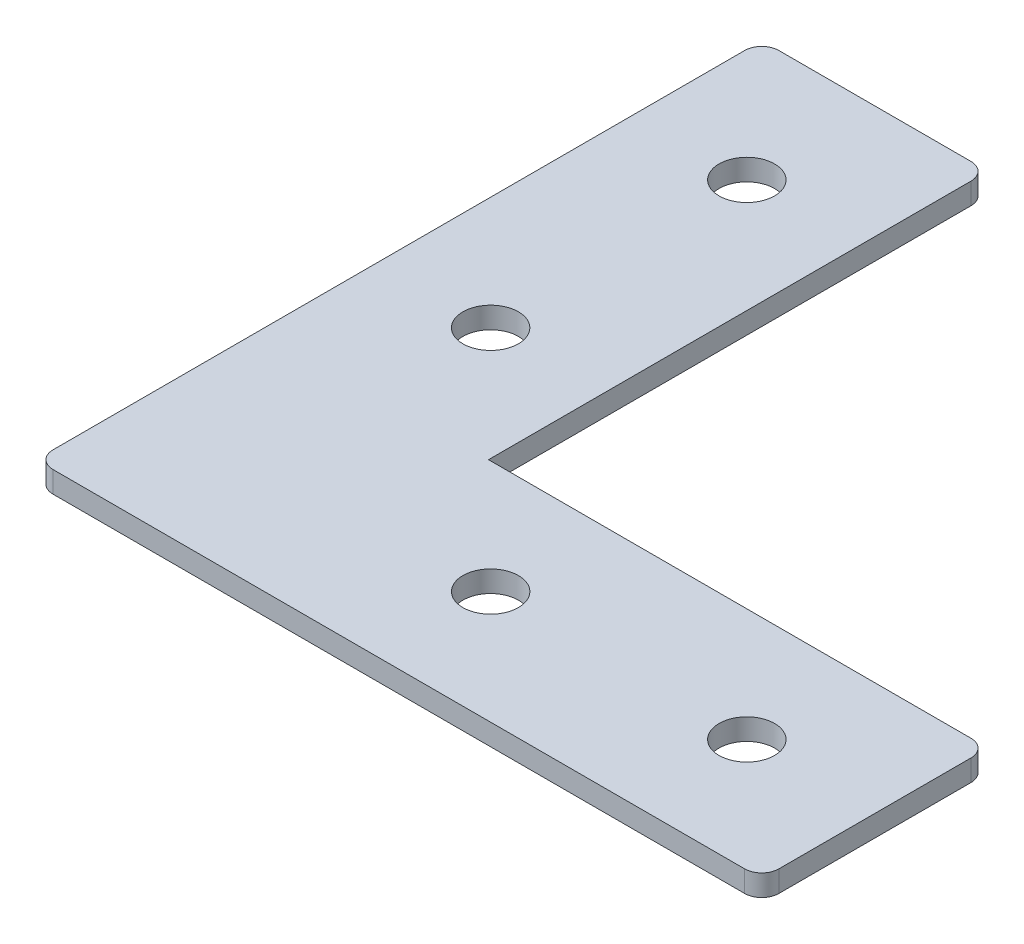
ISO-10303-21;
HEADER;
FILE_DESCRIPTION(('STEP AP214'),'2;1');
FILE_NAME('part.step','',(''),(''),'','','');
FILE_SCHEMA(('AUTOMOTIVE_DESIGN { 1 0 10303 214 1 1 1 1 }'));
ENDSEC;
DATA;
#1=APPLICATION_CONTEXT('core data for automotive mechanical design processes');
#2=APPLICATION_PROTOCOL_DEFINITION('international standard','automotive_design',2000,#1);
#3=PRODUCT_CONTEXT('',#1,'mechanical');
#4=PRODUCT('Part','Part','',(#3));
#5=PRODUCT_RELATED_PRODUCT_CATEGORY('part','',(#4));
#6=PRODUCT_DEFINITION_FORMATION('','',#4);
#7=PRODUCT_DEFINITION_CONTEXT('part definition',#1,'design');
#8=PRODUCT_DEFINITION('design','',#6,#7);
#9=PRODUCT_DEFINITION_SHAPE('','',#8);
#10=(LENGTH_UNIT() NAMED_UNIT(*) SI_UNIT(.MILLI.,.METRE.));
#11=(NAMED_UNIT(*) PLANE_ANGLE_UNIT() SI_UNIT($,.RADIAN.));
#12=(NAMED_UNIT(*) SI_UNIT($,.STERADIAN.) SOLID_ANGLE_UNIT());
#13=UNCERTAINTY_MEASURE_WITH_UNIT(LENGTH_MEASURE(1.E-05),#10,'distance_accuracy_value','');
#14=(GEOMETRIC_REPRESENTATION_CONTEXT(3) GLOBAL_UNCERTAINTY_ASSIGNED_CONTEXT((#13)) GLOBAL_UNIT_ASSIGNED_CONTEXT((#10,
#11,#12)) REPRESENTATION_CONTEXT('',''));
#15=CARTESIAN_POINT('',(0.,0.,0.));
#16=DIRECTION('',(0.,0.,1.));
#17=DIRECTION('',(1.,0.,0.));
#18=AXIS2_PLACEMENT_3D('',#15,#16,#17);
#19=CARTESIAN_POINT('',(0.,2.5,0.));
#20=DIRECTION('',(0.,0.,-1.));
#21=DIRECTION('',(-1.,0.,0.));
#22=AXIS2_PLACEMENT_3D('',#19,#20,#21);
#23=PLANE('',#22);
#24=DIRECTION('',(1.,0.,0.));
#25=VECTOR('',#24,1.);
#26=CARTESIAN_POINT('',(0.,0.,0.));
#27=LINE('',#26,#25);
#28=CARTESIAN_POINT('',(2.,0.,0.));
#29=VERTEX_POINT('',#28);
#30=CARTESIAN_POINT('',(83.,0.,0.));
#31=VERTEX_POINT('',#30);
#32=EDGE_CURVE('E159',#29,#31,#27,.T.);
#33=ORIENTED_EDGE('',*,*,#32,.T.);
#34=DIRECTION('',(0.,-1.,0.));
#35=VECTOR('',#34,1.);
#36=CARTESIAN_POINT('',(83.,2.5,0.));
#37=LINE('',#36,#35);
#38=CARTESIAN_POINT('',(83.,2.5,0.));
#39=VERTEX_POINT('',#38);
#40=EDGE_CURVE('E192',#31,#39,#37,.F.);
#41=ORIENTED_EDGE('',*,*,#40,.T.);
#42=DIRECTION('',(1.,0.,0.));
#43=VECTOR('',#42,1.);
#44=CARTESIAN_POINT('',(0.,2.5,0.));
#45=LINE('',#44,#43);
#46=CARTESIAN_POINT('',(2.,2.5,0.));
#47=VERTEX_POINT('',#46);
#48=EDGE_CURVE('E152',#47,#39,#45,.T.);
#49=ORIENTED_EDGE('',*,*,#48,.F.);
#50=DIRECTION('',(0.,-1.,0.));
#51=VECTOR('',#50,1.);
#52=CARTESIAN_POINT('',(2.,0.,0.));
#53=LINE('',#52,#51);
#54=EDGE_CURVE('E189',#47,#29,#53,.T.);
#55=ORIENTED_EDGE('',*,*,#54,.T.);
#56=EDGE_LOOP('',(#33,#41,#49,#55));
#57=FACE_BOUND('',#56,.T.);
#58=ADVANCED_FACE('F39',(#57),#23,.F.);
#59=CARTESIAN_POINT('',(85.,2.5,0.));
#60=DIRECTION('',(-1.,0.,0.));
#61=DIRECTION('',(0.,0.,1.));
#62=AXIS2_PLACEMENT_3D('',#59,#60,#61);
#63=PLANE('',#62);
#64=DIRECTION('',(0.,0.,-1.));
#65=VECTOR('',#64,1.);
#66=CARTESIAN_POINT('',(85.,2.5,0.));
#67=LINE('',#66,#65);
#68=CARTESIAN_POINT('',(85.,2.5,-2.));
#69=VERTEX_POINT('',#68);
#70=CARTESIAN_POINT('',(85.,2.5,-24.5));
#71=VERTEX_POINT('',#70);
#72=EDGE_CURVE('E150',#69,#71,#67,.T.);
#73=ORIENTED_EDGE('',*,*,#72,.F.);
#74=DIRECTION('',(0.,-1.,0.));
#75=VECTOR('',#74,1.);
#76=CARTESIAN_POINT('',(85.,2.5,-2.));
#77=LINE('',#76,#75);
#78=CARTESIAN_POINT('',(85.,0.,-2.));
#79=VERTEX_POINT('',#78);
#80=EDGE_CURVE('E176',#69,#79,#77,.T.);
#81=ORIENTED_EDGE('',*,*,#80,.T.);
#82=DIRECTION('',(0.,0.,-1.));
#83=VECTOR('',#82,1.);
#84=CARTESIAN_POINT('',(85.,0.,0.));
#85=LINE('',#84,#83);
#86=CARTESIAN_POINT('',(85.,0.,-24.5));
#87=VERTEX_POINT('',#86);
#88=EDGE_CURVE('E162',#79,#87,#85,.T.);
#89=ORIENTED_EDGE('',*,*,#88,.T.);
#90=DIRECTION('',(0.,-1.,0.));
#91=VECTOR('',#90,1.);
#92=CARTESIAN_POINT('',(85.,2.5,-24.5));
#93=LINE('',#92,#91);
#94=EDGE_CURVE('E135',#87,#71,#93,.F.);
#95=ORIENTED_EDGE('',*,*,#94,.T.);
#96=EDGE_LOOP('',(#73,#81,#89,#95));
#97=FACE_BOUND('',#96,.T.);
#98=ADVANCED_FACE('F290',(#97),#63,.F.);
#99=CARTESIAN_POINT('',(26.5,2.5,-26.5));
#100=DIRECTION('',(0.,0.,-1.));
#101=DIRECTION('',(-1.,0.,0.));
#102=AXIS2_PLACEMENT_3D('',#99,#100,#101);
#103=PLANE('',#102);
#104=DIRECTION('',(1.,0.,0.));
#105=VECTOR('',#104,1.);
#106=CARTESIAN_POINT('',(26.5,2.5,-26.5));
#107=LINE('',#106,#105);
#108=CARTESIAN_POINT('',(26.5,2.5,-26.5));
#109=VERTEX_POINT('',#108);
#110=CARTESIAN_POINT('',(83.,2.5,-26.5));
#111=VERTEX_POINT('',#110);
#112=EDGE_CURVE('E128',#109,#111,#107,.T.);
#113=ORIENTED_EDGE('',*,*,#112,.T.);
#114=DIRECTION('',(0.,-1.,0.));
#115=VECTOR('',#114,1.);
#116=CARTESIAN_POINT('',(83.,0.,-26.5));
#117=LINE('',#116,#115);
#118=CARTESIAN_POINT('',(83.,0.,-26.5));
#119=VERTEX_POINT('',#118);
#120=EDGE_CURVE('E202',#111,#119,#117,.T.);
#121=ORIENTED_EDGE('',*,*,#120,.T.);
#122=DIRECTION('',(1.,0.,0.));
#123=VECTOR('',#122,1.);
#124=CARTESIAN_POINT('',(26.5,0.,-26.5));
#125=LINE('',#124,#123);
#126=CARTESIAN_POINT('',(26.5,0.,-26.5));
#127=VERTEX_POINT('',#126);
#128=EDGE_CURVE('E131',#127,#119,#125,.T.);
#129=ORIENTED_EDGE('',*,*,#128,.F.);
#130=DIRECTION('',(0.,-1.,0.));
#131=VECTOR('',#130,1.);
#132=CARTESIAN_POINT('',(26.5,2.5,-26.5));
#133=LINE('',#132,#131);
#134=EDGE_CURVE('E123',#109,#127,#133,.T.);
#135=ORIENTED_EDGE('',*,*,#134,.F.);
#136=EDGE_LOOP('',(#113,#121,#129,#135));
#137=FACE_BOUND('',#136,.T.);
#138=ADVANCED_FACE('F125',(#137),#103,.T.);
#139=CARTESIAN_POINT('',(26.5,2.5,-26.5));
#140=DIRECTION('',(-1.,0.,0.));
#141=DIRECTION('',(0.,0.,1.));
#142=AXIS2_PLACEMENT_3D('',#139,#140,#141);
#143=PLANE('',#142);
#144=DIRECTION('',(0.,0.,-1.));
#145=VECTOR('',#144,1.);
#146=CARTESIAN_POINT('',(26.5,0.,-26.5));
#147=LINE('',#146,#145);
#148=CARTESIAN_POINT('',(26.5,0.,-83.));
#149=VERTEX_POINT('',#148);
#150=EDGE_CURVE('E167',#127,#149,#147,.T.);
#151=ORIENTED_EDGE('',*,*,#150,.T.);
#152=DIRECTION('',(0.,-1.,0.));
#153=VECTOR('',#152,1.);
#154=CARTESIAN_POINT('',(26.5,2.5,-83.));
#155=LINE('',#154,#153);
#156=CARTESIAN_POINT('',(26.5,2.5,-83.));
#157=VERTEX_POINT('',#156);
#158=EDGE_CURVE('E11',#149,#157,#155,.F.);
#159=ORIENTED_EDGE('',*,*,#158,.T.);
#160=DIRECTION('',(0.,0.,-1.));
#161=VECTOR('',#160,1.);
#162=CARTESIAN_POINT('',(26.5,2.5,-26.5));
#163=LINE('',#162,#161);
#164=EDGE_CURVE('E139',#109,#157,#163,.T.);
#165=ORIENTED_EDGE('',*,*,#164,.F.);
#166=ORIENTED_EDGE('',*,*,#134,.T.);
#167=EDGE_LOOP('',(#151,#159,#165,#166));
#168=FACE_BOUND('',#167,.T.);
#169=ADVANCED_FACE('F140',(#168),#143,.F.);
#170=CARTESIAN_POINT('',(0.,2.5,-85.));
#171=DIRECTION('',(0.,0.,-1.));
#172=DIRECTION('',(-1.,0.,0.));
#173=AXIS2_PLACEMENT_3D('',#170,#171,#172);
#174=PLANE('',#173);
#175=DIRECTION('',(1.,0.,0.));
#176=VECTOR('',#175,1.);
#177=CARTESIAN_POINT('',(0.,0.,-85.));
#178=LINE('',#177,#176);
#179=CARTESIAN_POINT('',(2.,0.,-85.));
#180=VERTEX_POINT('',#179);
#181=CARTESIAN_POINT('',(24.5,0.,-85.));
#182=VERTEX_POINT('',#181);
#183=EDGE_CURVE('E169',#180,#182,#178,.T.);
#184=ORIENTED_EDGE('',*,*,#183,.F.);
#185=DIRECTION('',(0.,-1.,0.));
#186=VECTOR('',#185,1.);
#187=CARTESIAN_POINT('',(2.,2.5,-85.));
#188=LINE('',#187,#186);
#189=CARTESIAN_POINT('',(2.,2.5,-85.));
#190=VERTEX_POINT('',#189);
#191=EDGE_CURVE('E47',#180,#190,#188,.F.);
#192=ORIENTED_EDGE('',*,*,#191,.T.);
#193=DIRECTION('',(1.,0.,0.));
#194=VECTOR('',#193,1.);
#195=CARTESIAN_POINT('',(0.,2.5,-85.));
#196=LINE('',#195,#194);
#197=CARTESIAN_POINT('',(24.5,2.5,-85.));
#198=VERTEX_POINT('',#197);
#199=EDGE_CURVE('E143',#190,#198,#196,.T.);
#200=ORIENTED_EDGE('',*,*,#199,.T.);
#201=DIRECTION('',(0.,-1.,0.));
#202=VECTOR('',#201,1.);
#203=CARTESIAN_POINT('',(24.5,0.,-85.));
#204=LINE('',#203,#202);
#205=EDGE_CURVE('E208',#198,#182,#204,.T.);
#206=ORIENTED_EDGE('',*,*,#205,.T.);
#207=EDGE_LOOP('',(#184,#192,#200,#206));
#208=FACE_BOUND('',#207,.T.);
#209=ADVANCED_FACE('F213',(#208),#174,.T.);
#210=CARTESIAN_POINT('',(0.,2.5,0.));
#211=DIRECTION('',(-1.,0.,0.));
#212=DIRECTION('',(0.,0.,1.));
#213=AXIS2_PLACEMENT_3D('',#210,#211,#212);
#214=PLANE('',#213);
#215=DIRECTION('',(0.,0.,-1.));
#216=VECTOR('',#215,1.);
#217=CARTESIAN_POINT('',(0.,0.,0.));
#218=LINE('',#217,#216);
#219=CARTESIAN_POINT('',(0.,0.,-2.));
#220=VERTEX_POINT('',#219);
#221=CARTESIAN_POINT('',(0.,0.,-83.));
#222=VERTEX_POINT('',#221);
#223=EDGE_CURVE('E172',#220,#222,#218,.T.);
#224=ORIENTED_EDGE('',*,*,#223,.F.);
#225=DIRECTION('',(0.,-1.,0.));
#226=VECTOR('',#225,1.);
#227=CARTESIAN_POINT('',(0.,2.5,-2.));
#228=LINE('',#227,#226);
#229=CARTESIAN_POINT('',(0.,2.5,-2.));
#230=VERTEX_POINT('',#229);
#231=EDGE_CURVE('E61',#220,#230,#228,.F.);
#232=ORIENTED_EDGE('',*,*,#231,.T.);
#233=DIRECTION('',(0.,0.,-1.));
#234=VECTOR('',#233,1.);
#235=CARTESIAN_POINT('',(0.,2.5,0.));
#236=LINE('',#235,#234);
#237=CARTESIAN_POINT('',(0.,2.5,-83.));
#238=VERTEX_POINT('',#237);
#239=EDGE_CURVE('E136',#230,#238,#236,.T.);
#240=ORIENTED_EDGE('',*,*,#239,.T.);
#241=DIRECTION('',(0.,-1.,0.));
#242=VECTOR('',#241,1.);
#243=CARTESIAN_POINT('',(0.,2.5,-83.));
#244=LINE('',#243,#242);
#245=EDGE_CURVE('E204',#238,#222,#244,.T.);
#246=ORIENTED_EDGE('',*,*,#245,.T.);
#247=EDGE_LOOP('',(#224,#232,#240,#246));
#248=FACE_BOUND('',#247,.T.);
#249=ADVANCED_FACE('F218',(#248),#214,.T.);
#250=CARTESIAN_POINT('',(0.,2.5,0.));
#251=DIRECTION('',(0.,1.,0.));
#252=DIRECTION('',(0.,0.,1.));
#253=AXIS2_PLACEMENT_3D('',#250,#251,#252);
#254=PLANE('',#253);
#255=CARTESIAN_POINT('',(13.25,2.5,-70.));
#256=DIRECTION('',(0.,1.,0.));
#257=DIRECTION('',(0.,0.,1.));
#258=AXIS2_PLACEMENT_3D('',#255,#256,#257);
#259=CIRCLE('',#258,3.25);
#260=CARTESIAN_POINT('',(13.25,2.5,-66.75));
#261=VERTEX_POINT('',#260);
#262=EDGE_CURVE('E245',#261,#261,#259,.T.);
#263=ORIENTED_EDGE('',*,*,#262,.F.);
#264=EDGE_LOOP('',(#263));
#265=FACE_BOUND('',#264,.T.);
#266=CARTESIAN_POINT('',(40.,2.5,-13.2499999999998));
#267=DIRECTION('',(0.,1.,0.));
#268=DIRECTION('',(0.,0.,1.));
#269=AXIS2_PLACEMENT_3D('',#266,#267,#268);
#270=CIRCLE('',#269,3.25000000000001);
#271=CARTESIAN_POINT('',(40.,2.5,-9.99999999999978));
#272=VERTEX_POINT('',#271);
#273=EDGE_CURVE('E236',#272,#272,#270,.T.);
#274=ORIENTED_EDGE('',*,*,#273,.F.);
#275=EDGE_LOOP('',(#274));
#276=FACE_BOUND('',#275,.T.);
#277=CARTESIAN_POINT('',(13.2500000000003,2.5,-40.));
#278=DIRECTION('',(0.,1.,0.));
#279=DIRECTION('',(0.,0.,1.));
#280=AXIS2_PLACEMENT_3D('',#277,#278,#279);
#281=CIRCLE('',#280,3.25);
#282=CARTESIAN_POINT('',(13.2500000000003,2.5,-36.75));
#283=VERTEX_POINT('',#282);
#284=EDGE_CURVE('E235',#283,#283,#281,.T.);
#285=ORIENTED_EDGE('',*,*,#284,.F.);
#286=EDGE_LOOP('',(#285));
#287=FACE_BOUND('',#286,.T.);
#288=CARTESIAN_POINT('',(70.,2.5,-13.25));
#289=DIRECTION('',(0.,1.,0.));
#290=DIRECTION('',(0.,0.,1.));
#291=AXIS2_PLACEMENT_3D('',#288,#289,#290);
#292=CIRCLE('',#291,3.25000000000001);
#293=CARTESIAN_POINT('',(70.,2.5,-9.99999999999999));
#294=VERTEX_POINT('',#293);
#295=EDGE_CURVE('E242',#294,#294,#292,.T.);
#296=ORIENTED_EDGE('',*,*,#295,.F.);
#297=EDGE_LOOP('',(#296));
#298=FACE_BOUND('',#297,.T.);
#299=ORIENTED_EDGE('',*,*,#48,.T.);
#300=CARTESIAN_POINT('',(83.,2.5,-2.));
#301=DIRECTION('',(0.,1.,0.));
#302=DIRECTION('',(0.,0.,1.));
#303=AXIS2_PLACEMENT_3D('',#300,#301,#302);
#304=CIRCLE('',#303,2.);
#305=EDGE_CURVE('E200',#39,#69,#304,.T.);
#306=ORIENTED_EDGE('',*,*,#305,.T.);
#307=ORIENTED_EDGE('',*,*,#72,.T.);
#308=CARTESIAN_POINT('',(83.,2.5,-24.5));
#309=DIRECTION('',(0.,1.,0.));
#310=DIRECTION('',(0.,0.,1.));
#311=AXIS2_PLACEMENT_3D('',#308,#309,#310);
#312=CIRCLE('',#311,2.);
#313=EDGE_CURVE('E149',#71,#111,#312,.T.);
#314=ORIENTED_EDGE('',*,*,#313,.T.);
#315=ORIENTED_EDGE('',*,*,#112,.F.);
#316=ORIENTED_EDGE('',*,*,#164,.T.);
#317=CARTESIAN_POINT('',(24.5,2.5,-83.));
#318=DIRECTION('',(0.,1.,0.));
#319=DIRECTION('',(0.,0.,1.));
#320=AXIS2_PLACEMENT_3D('',#317,#318,#319);
#321=CIRCLE('',#320,2.);
#322=EDGE_CURVE('E194',#157,#198,#321,.T.);
#323=ORIENTED_EDGE('',*,*,#322,.T.);
#324=ORIENTED_EDGE('',*,*,#199,.F.);
#325=CARTESIAN_POINT('',(2.,2.5,-83.));
#326=DIRECTION('',(0.,1.,0.));
#327=DIRECTION('',(0.,0.,1.));
#328=AXIS2_PLACEMENT_3D('',#325,#326,#327);
#329=CIRCLE('',#328,2.);
#330=EDGE_CURVE('E54',#190,#238,#329,.T.);
#331=ORIENTED_EDGE('',*,*,#330,.T.);
#332=ORIENTED_EDGE('',*,*,#239,.F.);
#333=CARTESIAN_POINT('',(2.,2.5,-2.));
#334=DIRECTION('',(0.,1.,0.));
#335=DIRECTION('',(0.,0.,1.));
#336=AXIS2_PLACEMENT_3D('',#333,#334,#335);
#337=CIRCLE('',#336,2.);
#338=EDGE_CURVE('E197',#230,#47,#337,.T.);
#339=ORIENTED_EDGE('',*,*,#338,.T.);
#340=EDGE_LOOP('',(#299,#306,#307,#314,#315,#316,#323,#324,#331,#332,#339));
#341=FACE_BOUND('',#340,.T.);
#342=ADVANCED_FACE('F146',(#265,#276,#287,#298,#341),#254,.T.);
#343=CARTESIAN_POINT('',(0.,0.,0.));
#344=DIRECTION('',(0.,1.,0.));
#345=DIRECTION('',(0.,0.,1.));
#346=AXIS2_PLACEMENT_3D('',#343,#344,#345);
#347=PLANE('',#346);
#348=CARTESIAN_POINT('',(13.25,0.,-70.));
#349=DIRECTION('',(0.,1.,0.));
#350=DIRECTION('',(0.,0.,1.));
#351=AXIS2_PLACEMENT_3D('',#348,#349,#350);
#352=CIRCLE('',#351,3.25);
#353=CARTESIAN_POINT('',(13.25,0.,-66.75));
#354=VERTEX_POINT('',#353);
#355=EDGE_CURVE('E163',#354,#354,#352,.T.);
#356=ORIENTED_EDGE('',*,*,#355,.T.);
#357=EDGE_LOOP('',(#356));
#358=FACE_BOUND('',#357,.T.);
#359=CARTESIAN_POINT('',(40.,0.,-13.2499999999998));
#360=DIRECTION('',(0.,1.,0.));
#361=DIRECTION('',(0.,0.,1.));
#362=AXIS2_PLACEMENT_3D('',#359,#360,#361);
#363=CIRCLE('',#362,3.25000000000001);
#364=CARTESIAN_POINT('',(40.,0.,-9.99999999999978));
#365=VERTEX_POINT('',#364);
#366=EDGE_CURVE('E246',#365,#365,#363,.T.);
#367=ORIENTED_EDGE('',*,*,#366,.T.);
#368=EDGE_LOOP('',(#367));
#369=FACE_BOUND('',#368,.T.);
#370=CARTESIAN_POINT('',(13.2500000000003,0.,-40.));
#371=DIRECTION('',(0.,1.,0.));
#372=DIRECTION('',(0.,0.,1.));
#373=AXIS2_PLACEMENT_3D('',#370,#371,#372);
#374=CIRCLE('',#373,3.25);
#375=CARTESIAN_POINT('',(13.2500000000003,0.,-36.75));
#376=VERTEX_POINT('',#375);
#377=EDGE_CURVE('E232',#376,#376,#374,.T.);
#378=ORIENTED_EDGE('',*,*,#377,.T.);
#379=EDGE_LOOP('',(#378));
#380=FACE_BOUND('',#379,.T.);
#381=CARTESIAN_POINT('',(70.,0.,-13.25));
#382=DIRECTION('',(0.,1.,0.));
#383=DIRECTION('',(0.,0.,1.));
#384=AXIS2_PLACEMENT_3D('',#381,#382,#383);
#385=CIRCLE('',#384,3.25000000000001);
#386=CARTESIAN_POINT('',(70.,0.,-9.99999999999999));
#387=VERTEX_POINT('',#386);
#388=EDGE_CURVE('E239',#387,#387,#385,.T.);
#389=ORIENTED_EDGE('',*,*,#388,.T.);
#390=EDGE_LOOP('',(#389));
#391=FACE_BOUND('',#390,.T.);
#392=ORIENTED_EDGE('',*,*,#88,.F.);
#393=CARTESIAN_POINT('',(83.,0.,-2.));
#394=DIRECTION('',(0.,1.,0.));
#395=DIRECTION('',(0.,0.,1.));
#396=AXIS2_PLACEMENT_3D('',#393,#394,#395);
#397=CIRCLE('',#396,2.);
#398=EDGE_CURVE('E187',#79,#31,#397,.F.);
#399=ORIENTED_EDGE('',*,*,#398,.T.);
#400=ORIENTED_EDGE('',*,*,#32,.F.);
#401=CARTESIAN_POINT('',(2.,0.,-2.));
#402=DIRECTION('',(0.,1.,0.));
#403=DIRECTION('',(0.,0.,1.));
#404=AXIS2_PLACEMENT_3D('',#401,#402,#403);
#405=CIRCLE('',#404,2.);
#406=EDGE_CURVE('E183',#29,#220,#405,.F.);
#407=ORIENTED_EDGE('',*,*,#406,.T.);
#408=ORIENTED_EDGE('',*,*,#223,.T.);
#409=CARTESIAN_POINT('',(2.,0.,-83.));
#410=DIRECTION('',(0.,1.,0.));
#411=DIRECTION('',(0.,0.,1.));
#412=AXIS2_PLACEMENT_3D('',#409,#410,#411);
#413=CIRCLE('',#412,2.);
#414=EDGE_CURVE('E181',#222,#180,#413,.F.);
#415=ORIENTED_EDGE('',*,*,#414,.T.);
#416=ORIENTED_EDGE('',*,*,#183,.T.);
#417=CARTESIAN_POINT('',(24.5,0.,-83.));
#418=DIRECTION('',(0.,1.,0.));
#419=DIRECTION('',(0.,0.,1.));
#420=AXIS2_PLACEMENT_3D('',#417,#418,#419);
#421=CIRCLE('',#420,2.);
#422=EDGE_CURVE('E179',#182,#149,#421,.F.);
#423=ORIENTED_EDGE('',*,*,#422,.T.);
#424=ORIENTED_EDGE('',*,*,#150,.F.);
#425=ORIENTED_EDGE('',*,*,#128,.T.);
#426=CARTESIAN_POINT('',(83.,0.,-24.5));
#427=DIRECTION('',(0.,1.,0.));
#428=DIRECTION('',(0.,0.,1.));
#429=AXIS2_PLACEMENT_3D('',#426,#427,#428);
#430=CIRCLE('',#429,2.);
#431=EDGE_CURVE('E185',#119,#87,#430,.F.);
#432=ORIENTED_EDGE('',*,*,#431,.T.);
#433=EDGE_LOOP('',(#392,#399,#400,#407,#408,#415,#416,#423,#424,#425,#432));
#434=FACE_BOUND('',#433,.T.);
#435=ADVANCED_FACE('F221',(#358,#369,#380,#391,#434),#347,.F.);
#436=CARTESIAN_POINT('',(70.,0.,-13.25));
#437=DIRECTION('',(0.,1.,0.));
#438=DIRECTION('',(0.,0.,1.));
#439=AXIS2_PLACEMENT_3D('',#436,#437,#438);
#440=CYLINDRICAL_SURFACE('',#439,3.25000000000001);
#441=ORIENTED_EDGE('',*,*,#388,.F.);
#442=EDGE_LOOP('',(#441));
#443=FACE_BOUND('',#442,.T.);
#444=ORIENTED_EDGE('',*,*,#295,.T.);
#445=EDGE_LOOP('',(#444));
#446=FACE_BOUND('',#445,.T.);
#447=ADVANCED_FACE('F275',(#443,#446),#440,.F.);
#448=CARTESIAN_POINT('',(13.2500000000003,0.,-40.));
#449=DIRECTION('',(0.,1.,0.));
#450=DIRECTION('',(0.,0.,1.));
#451=AXIS2_PLACEMENT_3D('',#448,#449,#450);
#452=CYLINDRICAL_SURFACE('',#451,3.25);
#453=ORIENTED_EDGE('',*,*,#377,.F.);
#454=EDGE_LOOP('',(#453));
#455=FACE_BOUND('',#454,.T.);
#456=ORIENTED_EDGE('',*,*,#284,.T.);
#457=EDGE_LOOP('',(#456));
#458=FACE_BOUND('',#457,.T.);
#459=ADVANCED_FACE('F277',(#455,#458),#452,.F.);
#460=CARTESIAN_POINT('',(40.,0.,-13.2499999999998));
#461=DIRECTION('',(0.,1.,0.));
#462=DIRECTION('',(0.,0.,1.));
#463=AXIS2_PLACEMENT_3D('',#460,#461,#462);
#464=CYLINDRICAL_SURFACE('',#463,3.25000000000001);
#465=ORIENTED_EDGE('',*,*,#366,.F.);
#466=EDGE_LOOP('',(#465));
#467=FACE_BOUND('',#466,.T.);
#468=ORIENTED_EDGE('',*,*,#273,.T.);
#469=EDGE_LOOP('',(#468));
#470=FACE_BOUND('',#469,.T.);
#471=ADVANCED_FACE('F262',(#467,#470),#464,.F.);
#472=CARTESIAN_POINT('',(13.25,0.,-70.));
#473=DIRECTION('',(0.,1.,0.));
#474=DIRECTION('',(0.,0.,1.));
#475=AXIS2_PLACEMENT_3D('',#472,#473,#474);
#476=CYLINDRICAL_SURFACE('',#475,3.25);
#477=ORIENTED_EDGE('',*,*,#355,.F.);
#478=EDGE_LOOP('',(#477));
#479=FACE_BOUND('',#478,.T.);
#480=ORIENTED_EDGE('',*,*,#262,.T.);
#481=EDGE_LOOP('',(#480));
#482=FACE_BOUND('',#481,.T.);
#483=ADVANCED_FACE('F258',(#479,#482),#476,.F.);
#484=CARTESIAN_POINT('',(83.,2.5,-2.));
#485=DIRECTION('',(0.,-1.,0.));
#486=DIRECTION('',(0.,0.,-1.));
#487=AXIS2_PLACEMENT_3D('',#484,#485,#486);
#488=CYLINDRICAL_SURFACE('',#487,2.);
#489=ORIENTED_EDGE('',*,*,#305,.F.);
#490=ORIENTED_EDGE('',*,*,#40,.F.);
#491=ORIENTED_EDGE('',*,*,#398,.F.);
#492=ORIENTED_EDGE('',*,*,#80,.F.);
#493=EDGE_LOOP('',(#489,#490,#491,#492));
#494=FACE_BOUND('',#493,.T.);
#495=ADVANCED_FACE('F261',(#494),#488,.T.);
#496=CARTESIAN_POINT('',(83.,2.5,-24.5));
#497=DIRECTION('',(0.,1.,0.));
#498=DIRECTION('',(0.,0.,1.));
#499=AXIS2_PLACEMENT_3D('',#496,#497,#498);
#500=CYLINDRICAL_SURFACE('',#499,2.);
#501=ORIENTED_EDGE('',*,*,#313,.F.);
#502=ORIENTED_EDGE('',*,*,#94,.F.);
#503=ORIENTED_EDGE('',*,*,#431,.F.);
#504=ORIENTED_EDGE('',*,*,#120,.F.);
#505=EDGE_LOOP('',(#501,#502,#503,#504));
#506=FACE_BOUND('',#505,.T.);
#507=ADVANCED_FACE('F301',(#506),#500,.T.);
#508=CARTESIAN_POINT('',(2.,2.5,-2.));
#509=DIRECTION('',(0.,1.,0.));
#510=DIRECTION('',(0.,0.,1.));
#511=AXIS2_PLACEMENT_3D('',#508,#509,#510);
#512=CYLINDRICAL_SURFACE('',#511,2.);
#513=ORIENTED_EDGE('',*,*,#338,.F.);
#514=ORIENTED_EDGE('',*,*,#231,.F.);
#515=ORIENTED_EDGE('',*,*,#406,.F.);
#516=ORIENTED_EDGE('',*,*,#54,.F.);
#517=EDGE_LOOP('',(#513,#514,#515,#516));
#518=FACE_BOUND('',#517,.T.);
#519=ADVANCED_FACE('F226',(#518),#512,.T.);
#520=CARTESIAN_POINT('',(2.,2.5,-83.));
#521=DIRECTION('',(0.,-1.,0.));
#522=DIRECTION('',(0.,0.,-1.));
#523=AXIS2_PLACEMENT_3D('',#520,#521,#522);
#524=CYLINDRICAL_SURFACE('',#523,2.);
#525=ORIENTED_EDGE('',*,*,#330,.F.);
#526=ORIENTED_EDGE('',*,*,#191,.F.);
#527=ORIENTED_EDGE('',*,*,#414,.F.);
#528=ORIENTED_EDGE('',*,*,#245,.F.);
#529=EDGE_LOOP('',(#525,#526,#527,#528));
#530=FACE_BOUND('',#529,.T.);
#531=ADVANCED_FACE('F217',(#530),#524,.T.);
#532=CARTESIAN_POINT('',(24.5,2.5,-83.));
#533=DIRECTION('',(0.,1.,0.));
#534=DIRECTION('',(0.,0.,1.));
#535=AXIS2_PLACEMENT_3D('',#532,#533,#534);
#536=CYLINDRICAL_SURFACE('',#535,2.);
#537=ORIENTED_EDGE('',*,*,#322,.F.);
#538=ORIENTED_EDGE('',*,*,#158,.F.);
#539=ORIENTED_EDGE('',*,*,#422,.F.);
#540=ORIENTED_EDGE('',*,*,#205,.F.);
#541=EDGE_LOOP('',(#537,#538,#539,#540));
#542=FACE_BOUND('',#541,.T.);
#543=ADVANCED_FACE('F41',(#542),#536,.T.);
#544=CLOSED_SHELL('',(#58,#98,#138,#169,#209,#249,#342,#435,#447,#459,#471,#483,#495,#507,#519,
#531,#543));
#545=MANIFOLD_SOLID_BREP('B2',#544);
#546=ADVANCED_BREP_SHAPE_REPRESENTATION('',(#18,#545),#14);
#547=SHAPE_DEFINITION_REPRESENTATION(#9,#546);
ENDSEC;
END-ISO-10303-21;
